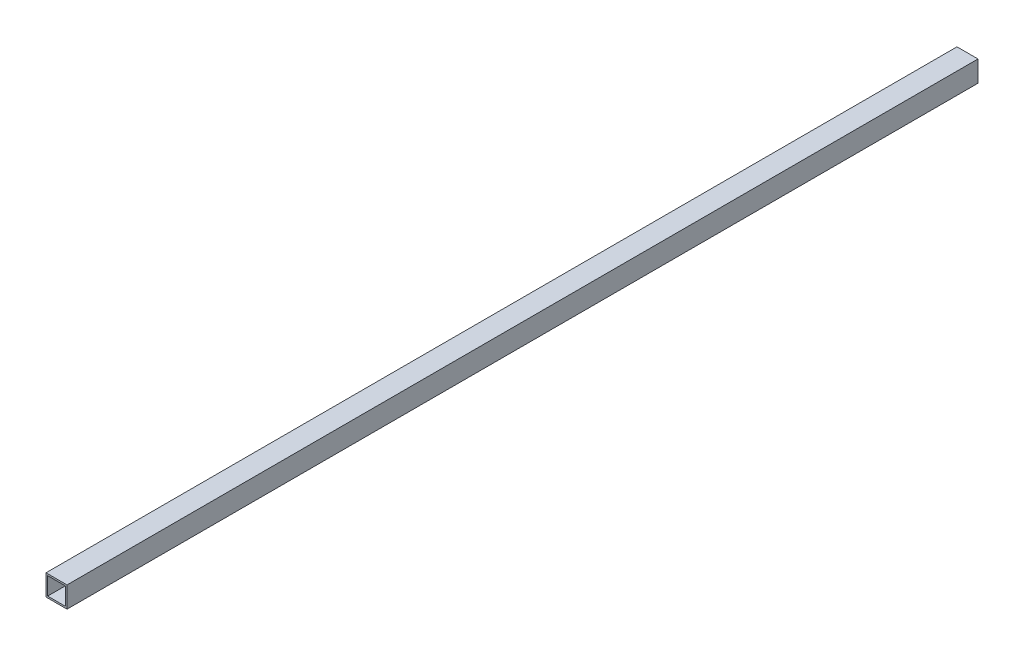
ISO-10303-21;
HEADER;
FILE_DESCRIPTION(('STEP AP214'),'2;1');
FILE_NAME('part.step','',(''),(''),'','','');
FILE_SCHEMA(('AUTOMOTIVE_DESIGN { 1 0 10303 214 1 1 1 1 }'));
ENDSEC;
DATA;
#1=APPLICATION_CONTEXT('core data for automotive mechanical design processes');
#2=APPLICATION_PROTOCOL_DEFINITION('international standard','automotive_design',2000,#1);
#3=PRODUCT_CONTEXT('',#1,'mechanical');
#4=PRODUCT('Part','Part','',(#3));
#5=PRODUCT_RELATED_PRODUCT_CATEGORY('part','',(#4));
#6=PRODUCT_DEFINITION_FORMATION('','',#4);
#7=PRODUCT_DEFINITION_CONTEXT('part definition',#1,'design');
#8=PRODUCT_DEFINITION('design','',#6,#7);
#9=PRODUCT_DEFINITION_SHAPE('','',#8);
#10=(LENGTH_UNIT() NAMED_UNIT(*) SI_UNIT(.MILLI.,.METRE.));
#11=(NAMED_UNIT(*) PLANE_ANGLE_UNIT() SI_UNIT($,.RADIAN.));
#12=(NAMED_UNIT(*) SI_UNIT($,.STERADIAN.) SOLID_ANGLE_UNIT());
#13=UNCERTAINTY_MEASURE_WITH_UNIT(LENGTH_MEASURE(1.E-05),#10,'distance_accuracy_value','');
#14=(GEOMETRIC_REPRESENTATION_CONTEXT(3) GLOBAL_UNCERTAINTY_ASSIGNED_CONTEXT((#13)) GLOBAL_UNIT_ASSIGNED_CONTEXT((#10,
#11,#12)) REPRESENTATION_CONTEXT('',''));
#15=CARTESIAN_POINT('',(0.,0.,0.));
#16=DIRECTION('',(0.,0.,1.));
#17=DIRECTION('',(1.,0.,0.));
#18=AXIS2_PLACEMENT_3D('',#15,#16,#17);
#19=CARTESIAN_POINT('',(0.,0.,650.));
#20=DIRECTION('',(0.,0.,-1.));
#21=DIRECTION('',(-1.,0.,0.));
#22=AXIS2_PLACEMENT_3D('',#19,#20,#21);
#23=PLANE('',#22);
#24=DIRECTION('',(0.,1.,0.));
#25=VECTOR('',#24,1.);
#26=CARTESIAN_POINT('',(7.5,-7.5,650.));
#27=LINE('',#26,#25);
#28=CARTESIAN_POINT('',(7.5,-7.5,650.));
#29=VERTEX_POINT('',#28);
#30=CARTESIAN_POINT('',(7.5,7.5,650.));
#31=VERTEX_POINT('',#30);
#32=EDGE_CURVE('E153',#29,#31,#27,.T.);
#33=ORIENTED_EDGE('',*,*,#32,.T.);
#34=DIRECTION('',(-1.,0.,0.));
#35=VECTOR('',#34,1.);
#36=CARTESIAN_POINT('',(-7.5,7.5,650.));
#37=LINE('',#36,#35);
#38=CARTESIAN_POINT('',(-7.5,7.5,650.));
#39=VERTEX_POINT('',#38);
#40=EDGE_CURVE('E157',#31,#39,#37,.T.);
#41=ORIENTED_EDGE('',*,*,#40,.T.);
#42=DIRECTION('',(0.,-1.,0.));
#43=VECTOR('',#42,1.);
#44=CARTESIAN_POINT('',(-7.5,-7.5,650.));
#45=LINE('',#44,#43);
#46=CARTESIAN_POINT('',(-7.5,-7.5,650.));
#47=VERTEX_POINT('',#46);
#48=EDGE_CURVE('E161',#39,#47,#45,.T.);
#49=ORIENTED_EDGE('',*,*,#48,.T.);
#50=DIRECTION('',(1.,0.,0.));
#51=VECTOR('',#50,1.);
#52=CARTESIAN_POINT('',(-7.5,-7.5,650.));
#53=LINE('',#52,#51);
#54=EDGE_CURVE('E164',#47,#29,#53,.T.);
#55=ORIENTED_EDGE('',*,*,#54,.T.);
#56=EDGE_LOOP('',(#33,#41,#49,#55));
#57=FACE_BOUND('',#56,.T.);
#58=DIRECTION('',(1.,0.,0.));
#59=VECTOR('',#58,1.);
#60=CARTESIAN_POINT('',(-6.3,-6.3,650.));
#61=LINE('',#60,#59);
#62=CARTESIAN_POINT('',(-6.3,-6.3,650.));
#63=VERTEX_POINT('',#62);
#64=CARTESIAN_POINT('',(6.3,-6.3,650.));
#65=VERTEX_POINT('',#64);
#66=EDGE_CURVE('E105',#63,#65,#61,.T.);
#67=ORIENTED_EDGE('',*,*,#66,.F.);
#68=DIRECTION('',(0.,-1.,0.));
#69=VECTOR('',#68,1.);
#70=CARTESIAN_POINT('',(-6.3,-6.3,650.));
#71=LINE('',#70,#69);
#72=CARTESIAN_POINT('',(-6.3,6.3,650.));
#73=VERTEX_POINT('',#72);
#74=EDGE_CURVE('E131',#73,#63,#71,.T.);
#75=ORIENTED_EDGE('',*,*,#74,.F.);
#76=DIRECTION('',(-1.,0.,0.));
#77=VECTOR('',#76,1.);
#78=CARTESIAN_POINT('',(-6.3,6.3,650.));
#79=LINE('',#78,#77);
#80=CARTESIAN_POINT('',(6.3,6.3,650.));
#81=VERTEX_POINT('',#80);
#82=EDGE_CURVE('E127',#81,#73,#79,.T.);
#83=ORIENTED_EDGE('',*,*,#82,.F.);
#84=DIRECTION('',(0.,1.,0.));
#85=VECTOR('',#84,1.);
#86=CARTESIAN_POINT('',(6.3,-6.3,650.));
#87=LINE('',#86,#85);
#88=EDGE_CURVE('E114',#65,#81,#87,.T.);
#89=ORIENTED_EDGE('',*,*,#88,.F.);
#90=EDGE_LOOP('',(#67,#75,#83,#89));
#91=FACE_BOUND('',#90,.T.);
#92=ADVANCED_FACE('F39',(#57,#91),#23,.F.);
#93=CARTESIAN_POINT('',(0.,0.,0.));
#94=DIRECTION('',(0.,0.,-1.));
#95=DIRECTION('',(-1.,0.,0.));
#96=AXIS2_PLACEMENT_3D('',#93,#94,#95);
#97=PLANE('',#96);
#98=DIRECTION('',(0.,1.,0.));
#99=VECTOR('',#98,1.);
#100=CARTESIAN_POINT('',(7.5,-7.5,0.));
#101=LINE('',#100,#99);
#102=CARTESIAN_POINT('',(7.5,-7.5,0.));
#103=VERTEX_POINT('',#102);
#104=CARTESIAN_POINT('',(7.5,7.5,0.));
#105=VERTEX_POINT('',#104);
#106=EDGE_CURVE('E123',#103,#105,#101,.T.);
#107=ORIENTED_EDGE('',*,*,#106,.F.);
#108=DIRECTION('',(1.,0.,0.));
#109=VECTOR('',#108,1.);
#110=CARTESIAN_POINT('',(-7.5,-7.5,0.));
#111=LINE('',#110,#109);
#112=CARTESIAN_POINT('',(-7.5,-7.5,0.));
#113=VERTEX_POINT('',#112);
#114=EDGE_CURVE('E158',#113,#103,#111,.T.);
#115=ORIENTED_EDGE('',*,*,#114,.F.);
#116=DIRECTION('',(0.,-1.,0.));
#117=VECTOR('',#116,1.);
#118=CARTESIAN_POINT('',(-7.5,-7.5,0.));
#119=LINE('',#118,#117);
#120=CARTESIAN_POINT('',(-7.5,7.5,0.));
#121=VERTEX_POINT('',#120);
#122=EDGE_CURVE('E174',#121,#113,#119,.T.);
#123=ORIENTED_EDGE('',*,*,#122,.F.);
#124=DIRECTION('',(-1.,0.,0.));
#125=VECTOR('',#124,1.);
#126=CARTESIAN_POINT('',(-7.5,7.5,0.));
#127=LINE('',#126,#125);
#128=EDGE_CURVE('E171',#105,#121,#127,.T.);
#129=ORIENTED_EDGE('',*,*,#128,.F.);
#130=EDGE_LOOP('',(#107,#115,#123,#129));
#131=FACE_BOUND('',#130,.T.);
#132=DIRECTION('',(0.,-1.,0.));
#133=VECTOR('',#132,1.);
#134=CARTESIAN_POINT('',(-6.3,-6.3,0.));
#135=LINE('',#134,#133);
#136=CARTESIAN_POINT('',(-6.3,6.3,0.));
#137=VERTEX_POINT('',#136);
#138=CARTESIAN_POINT('',(-6.3,-6.3,0.));
#139=VERTEX_POINT('',#138);
#140=EDGE_CURVE('E115',#137,#139,#135,.T.);
#141=ORIENTED_EDGE('',*,*,#140,.T.);
#142=DIRECTION('',(1.,0.,0.));
#143=VECTOR('',#142,1.);
#144=CARTESIAN_POINT('',(-6.3,-6.3,0.));
#145=LINE('',#144,#143);
#146=CARTESIAN_POINT('',(6.3,-6.3,0.));
#147=VERTEX_POINT('',#146);
#148=EDGE_CURVE('E63',#139,#147,#145,.T.);
#149=ORIENTED_EDGE('',*,*,#148,.T.);
#150=DIRECTION('',(0.,1.,0.));
#151=VECTOR('',#150,1.);
#152=CARTESIAN_POINT('',(6.3,-6.3,0.));
#153=LINE('',#152,#151);
#154=CARTESIAN_POINT('',(6.3,6.3,0.));
#155=VERTEX_POINT('',#154);
#156=EDGE_CURVE('E121',#147,#155,#153,.T.);
#157=ORIENTED_EDGE('',*,*,#156,.T.);
#158=DIRECTION('',(-1.,0.,0.));
#159=VECTOR('',#158,1.);
#160=CARTESIAN_POINT('',(-6.3,6.3,0.));
#161=LINE('',#160,#159);
#162=EDGE_CURVE('E140',#155,#137,#161,.T.);
#163=ORIENTED_EDGE('',*,*,#162,.T.);
#164=EDGE_LOOP('',(#141,#149,#157,#163));
#165=FACE_BOUND('',#164,.T.);
#166=ADVANCED_FACE('F197',(#131,#165),#97,.T.);
#167=CARTESIAN_POINT('',(7.5,-7.5,650.));
#168=DIRECTION('',(-1.,0.,0.));
#169=DIRECTION('',(0.,0.,1.));
#170=AXIS2_PLACEMENT_3D('',#167,#168,#169);
#171=PLANE('',#170);
#172=ORIENTED_EDGE('',*,*,#106,.T.);
#173=DIRECTION('',(0.,0.,-1.));
#174=VECTOR('',#173,1.);
#175=CARTESIAN_POINT('',(7.5,7.5,650.));
#176=LINE('',#175,#174);
#177=EDGE_CURVE('E11',#31,#105,#176,.T.);
#178=ORIENTED_EDGE('',*,*,#177,.F.);
#179=ORIENTED_EDGE('',*,*,#32,.F.);
#180=DIRECTION('',(0.,0.,-1.));
#181=VECTOR('',#180,1.);
#182=CARTESIAN_POINT('',(7.5,-7.5,650.));
#183=LINE('',#182,#181);
#184=EDGE_CURVE('E167',#29,#103,#183,.T.);
#185=ORIENTED_EDGE('',*,*,#184,.T.);
#186=EDGE_LOOP('',(#172,#178,#179,#185));
#187=FACE_BOUND('',#186,.T.);
#188=ADVANCED_FACE('F41',(#187),#171,.F.);
#189=CARTESIAN_POINT('',(-7.5,7.5,650.));
#190=DIRECTION('',(0.,-1.,0.));
#191=DIRECTION('',(0.,0.,-1.));
#192=AXIS2_PLACEMENT_3D('',#189,#190,#191);
#193=PLANE('',#192);
#194=ORIENTED_EDGE('',*,*,#128,.T.);
#195=DIRECTION('',(0.,0.,-1.));
#196=VECTOR('',#195,1.);
#197=CARTESIAN_POINT('',(-7.5,7.5,650.));
#198=LINE('',#197,#196);
#199=EDGE_CURVE('E48',#39,#121,#198,.T.);
#200=ORIENTED_EDGE('',*,*,#199,.F.);
#201=ORIENTED_EDGE('',*,*,#40,.F.);
#202=ORIENTED_EDGE('',*,*,#177,.T.);
#203=EDGE_LOOP('',(#194,#200,#201,#202));
#204=FACE_BOUND('',#203,.T.);
#205=ADVANCED_FACE('F207',(#204),#193,.F.);
#206=CARTESIAN_POINT('',(-7.5,-7.5,650.));
#207=DIRECTION('',(1.,0.,0.));
#208=DIRECTION('',(0.,0.,-1.));
#209=AXIS2_PLACEMENT_3D('',#206,#207,#208);
#210=PLANE('',#209);
#211=ORIENTED_EDGE('',*,*,#122,.T.);
#212=DIRECTION('',(0.,0.,-1.));
#213=VECTOR('',#212,1.);
#214=CARTESIAN_POINT('',(-7.5,-7.5,650.));
#215=LINE('',#214,#213);
#216=EDGE_CURVE('E182',#47,#113,#215,.T.);
#217=ORIENTED_EDGE('',*,*,#216,.F.);
#218=ORIENTED_EDGE('',*,*,#48,.F.);
#219=ORIENTED_EDGE('',*,*,#199,.T.);
#220=EDGE_LOOP('',(#211,#217,#218,#219));
#221=FACE_BOUND('',#220,.T.);
#222=ADVANCED_FACE('F191',(#221),#210,.F.);
#223=CARTESIAN_POINT('',(-7.5,-7.5,650.));
#224=DIRECTION('',(0.,1.,0.));
#225=DIRECTION('',(0.,0.,1.));
#226=AXIS2_PLACEMENT_3D('',#223,#224,#225);
#227=PLANE('',#226);
#228=ORIENTED_EDGE('',*,*,#114,.T.);
#229=ORIENTED_EDGE('',*,*,#184,.F.);
#230=ORIENTED_EDGE('',*,*,#54,.F.);
#231=ORIENTED_EDGE('',*,*,#216,.T.);
#232=EDGE_LOOP('',(#228,#229,#230,#231));
#233=FACE_BOUND('',#232,.T.);
#234=ADVANCED_FACE('F201',(#233),#227,.F.);
#235=CARTESIAN_POINT('',(-6.3,-6.3,650.));
#236=DIRECTION('',(0.,1.,0.));
#237=DIRECTION('',(0.,0.,1.));
#238=AXIS2_PLACEMENT_3D('',#235,#236,#237);
#239=PLANE('',#238);
#240=ORIENTED_EDGE('',*,*,#148,.F.);
#241=DIRECTION('',(0.,0.,-1.));
#242=VECTOR('',#241,1.);
#243=CARTESIAN_POINT('',(-6.3,-6.3,650.));
#244=LINE('',#243,#242);
#245=EDGE_CURVE('E109',#63,#139,#244,.T.);
#246=ORIENTED_EDGE('',*,*,#245,.F.);
#247=ORIENTED_EDGE('',*,*,#66,.T.);
#248=DIRECTION('',(0.,0.,-1.));
#249=VECTOR('',#248,1.);
#250=CARTESIAN_POINT('',(6.3,-6.3,650.));
#251=LINE('',#250,#249);
#252=EDGE_CURVE('E108',#65,#147,#251,.T.);
#253=ORIENTED_EDGE('',*,*,#252,.T.);
#254=EDGE_LOOP('',(#240,#246,#247,#253));
#255=FACE_BOUND('',#254,.T.);
#256=ADVANCED_FACE('F107',(#255),#239,.T.);
#257=CARTESIAN_POINT('',(6.3,-6.3,650.));
#258=DIRECTION('',(-1.,0.,0.));
#259=DIRECTION('',(0.,0.,1.));
#260=AXIS2_PLACEMENT_3D('',#257,#258,#259);
#261=PLANE('',#260);
#262=ORIENTED_EDGE('',*,*,#156,.F.);
#263=ORIENTED_EDGE('',*,*,#252,.F.);
#264=ORIENTED_EDGE('',*,*,#88,.T.);
#265=DIRECTION('',(0.,0.,-1.));
#266=VECTOR('',#265,1.);
#267=CARTESIAN_POINT('',(6.3,6.3,650.));
#268=LINE('',#267,#266);
#269=EDGE_CURVE('E124',#81,#155,#268,.T.);
#270=ORIENTED_EDGE('',*,*,#269,.T.);
#271=EDGE_LOOP('',(#262,#263,#264,#270));
#272=FACE_BOUND('',#271,.T.);
#273=ADVANCED_FACE('F118',(#272),#261,.T.);
#274=CARTESIAN_POINT('',(-6.3,6.3,650.));
#275=DIRECTION('',(0.,-1.,0.));
#276=DIRECTION('',(0.,0.,-1.));
#277=AXIS2_PLACEMENT_3D('',#274,#275,#276);
#278=PLANE('',#277);
#279=ORIENTED_EDGE('',*,*,#162,.F.);
#280=ORIENTED_EDGE('',*,*,#269,.F.);
#281=ORIENTED_EDGE('',*,*,#82,.T.);
#282=DIRECTION('',(0.,0.,-1.));
#283=VECTOR('',#282,1.);
#284=CARTESIAN_POINT('',(-6.3,6.3,650.));
#285=LINE('',#284,#283);
#286=EDGE_CURVE('E55',#73,#137,#285,.T.);
#287=ORIENTED_EDGE('',*,*,#286,.T.);
#288=EDGE_LOOP('',(#279,#280,#281,#287));
#289=FACE_BOUND('',#288,.T.);
#290=ADVANCED_FACE('F230',(#289),#278,.T.);
#291=CARTESIAN_POINT('',(-6.3,-6.3,650.));
#292=DIRECTION('',(1.,0.,0.));
#293=DIRECTION('',(0.,0.,-1.));
#294=AXIS2_PLACEMENT_3D('',#291,#292,#293);
#295=PLANE('',#294);
#296=ORIENTED_EDGE('',*,*,#140,.F.);
#297=ORIENTED_EDGE('',*,*,#286,.F.);
#298=ORIENTED_EDGE('',*,*,#74,.T.);
#299=ORIENTED_EDGE('',*,*,#245,.T.);
#300=EDGE_LOOP('',(#296,#297,#298,#299));
#301=FACE_BOUND('',#300,.T.);
#302=ADVANCED_FACE('F234',(#301),#295,.T.);
#303=CLOSED_SHELL('',(#92,#166,#188,#205,#222,#234,#256,#273,#290,#302));
#304=MANIFOLD_SOLID_BREP('B2',#303);
#305=ADVANCED_BREP_SHAPE_REPRESENTATION('',(#18,#304),#14);
#306=SHAPE_DEFINITION_REPRESENTATION(#9,#305);
ENDSEC;
END-ISO-10303-21;
